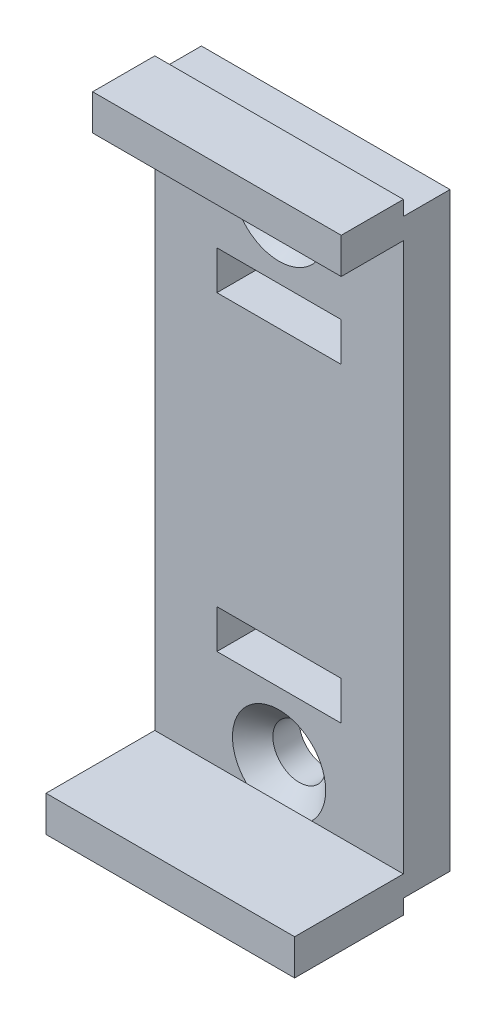
ISO-10303-21;
HEADER;
FILE_DESCRIPTION(('STEP AP214'),'2;1');
FILE_NAME('part.step','',(''),(''),'','','');
FILE_SCHEMA(('AUTOMOTIVE_DESIGN { 1 0 10303 214 1 1 1 1 }'));
ENDSEC;
DATA;
#1=APPLICATION_CONTEXT('core data for automotive mechanical design processes');
#2=APPLICATION_PROTOCOL_DEFINITION('international standard','automotive_design',2000,#1);
#3=PRODUCT_CONTEXT('',#1,'mechanical');
#4=PRODUCT('Part','Part','',(#3));
#5=PRODUCT_RELATED_PRODUCT_CATEGORY('part','',(#4));
#6=PRODUCT_DEFINITION_FORMATION('','',#4);
#7=PRODUCT_DEFINITION_CONTEXT('part definition',#1,'design');
#8=PRODUCT_DEFINITION('design','',#6,#7);
#9=PRODUCT_DEFINITION_SHAPE('','',#8);
#10=(LENGTH_UNIT() NAMED_UNIT(*) SI_UNIT(.MILLI.,.METRE.));
#11=(NAMED_UNIT(*) PLANE_ANGLE_UNIT() SI_UNIT($,.RADIAN.));
#12=(NAMED_UNIT(*) SI_UNIT($,.STERADIAN.) SOLID_ANGLE_UNIT());
#13=UNCERTAINTY_MEASURE_WITH_UNIT(LENGTH_MEASURE(1.E-05),#10,'distance_accuracy_value','');
#14=(GEOMETRIC_REPRESENTATION_CONTEXT(3) GLOBAL_UNCERTAINTY_ASSIGNED_CONTEXT((#13)) GLOBAL_UNIT_ASSIGNED_CONTEXT((#10,
#11,#12)) REPRESENTATION_CONTEXT('',''));
#15=CARTESIAN_POINT('',(0.,0.,0.));
#16=DIRECTION('',(0.,0.,1.));
#17=DIRECTION('',(1.,0.,0.));
#18=AXIS2_PLACEMENT_3D('',#15,#16,#17);
#19=CARTESIAN_POINT('',(0.,15.5,4.));
#20=DIRECTION('',(0.,0.,-1.));
#21=DIRECTION('',(-1.,0.,0.));
#22=AXIS2_PLACEMENT_3D('',#19,#20,#21);
#23=CYLINDRICAL_SURFACE('',#22,1.7);
#24=CARTESIAN_POINT('',(0.,15.5,0.));
#25=DIRECTION('',(0.,0.,1.));
#26=DIRECTION('',(1.,0.,0.));
#27=AXIS2_PLACEMENT_3D('',#24,#25,#26);
#28=CIRCLE('',#27,1.7);
#29=CARTESIAN_POINT('',(1.7,15.5,0.));
#30=VERTEX_POINT('',#29);
#31=EDGE_CURVE('E279',#30,#30,#28,.F.);
#32=ORIENTED_EDGE('',*,*,#31,.T.);
#33=EDGE_LOOP('',(#32));
#34=FACE_BOUND('',#33,.T.);
#35=CARTESIAN_POINT('',(0.,15.5,1.7));
#36=DIRECTION('',(0.,0.,1.));
#37=DIRECTION('',(1.,0.,0.));
#38=AXIS2_PLACEMENT_3D('',#35,#36,#37);
#39=CIRCLE('',#38,1.7);
#40=CARTESIAN_POINT('',(1.7,15.5,1.7));
#41=VERTEX_POINT('',#40);
#42=EDGE_CURVE('E45',#41,#41,#39,.T.);
#43=ORIENTED_EDGE('',*,*,#42,.T.);
#44=EDGE_LOOP('',(#43));
#45=FACE_BOUND('',#44,.T.);
#46=ADVANCED_FACE('F41',(#34,#45),#23,.F.);
#47=CARTESIAN_POINT('',(0.,-15.5,4.));
#48=DIRECTION('',(0.,0.,-1.));
#49=DIRECTION('',(-1.,0.,0.));
#50=AXIS2_PLACEMENT_3D('',#47,#48,#49);
#51=CYLINDRICAL_SURFACE('',#50,1.7);
#52=CARTESIAN_POINT('',(0.,-15.5,0.));
#53=DIRECTION('',(0.,0.,1.));
#54=DIRECTION('',(1.,0.,0.));
#55=AXIS2_PLACEMENT_3D('',#52,#53,#54);
#56=CIRCLE('',#55,1.7);
#57=CARTESIAN_POINT('',(1.7,-15.5,0.));
#58=VERTEX_POINT('',#57);
#59=EDGE_CURVE('E282',#58,#58,#56,.F.);
#60=ORIENTED_EDGE('',*,*,#59,.T.);
#61=EDGE_LOOP('',(#60));
#62=FACE_BOUND('',#61,.T.);
#63=CARTESIAN_POINT('',(0.,-15.5,1.7));
#64=DIRECTION('',(0.,0.,1.));
#65=DIRECTION('',(1.,0.,0.));
#66=AXIS2_PLACEMENT_3D('',#63,#64,#65);
#67=CIRCLE('',#66,1.7);
#68=CARTESIAN_POINT('',(1.7,-15.5,1.7));
#69=VERTEX_POINT('',#68);
#70=EDGE_CURVE('E194',#69,#69,#67,.T.);
#71=ORIENTED_EDGE('',*,*,#70,.T.);
#72=EDGE_LOOP('',(#71));
#73=FACE_BOUND('',#72,.T.);
#74=ADVANCED_FACE('F442',(#62,#73),#51,.F.);
#75=CARTESIAN_POINT('',(0.,0.,3.));
#76=DIRECTION('',(0.,0.,1.));
#77=DIRECTION('',(1.,0.,0.));
#78=AXIS2_PLACEMENT_3D('',#75,#76,#77);
#79=PLANE('',#78);
#80=DIRECTION('',(-1.,0.,0.));
#81=VECTOR('',#80,1.);
#82=CARTESIAN_POINT('',(8.,-17.65,3.));
#83=LINE('',#82,#81);
#84=CARTESIAN_POINT('',(-2.09224759529076,-17.65,3.));
#85=VERTEX_POINT('',#84);
#86=CARTESIAN_POINT('',(-8.,-17.65,3.));
#87=VERTEX_POINT('',#86);
#88=EDGE_CURVE('E209',#85,#87,#83,.T.);
#89=ORIENTED_EDGE('',*,*,#88,.F.);
#90=CARTESIAN_POINT('',(0.,-15.5,3.));
#91=DIRECTION('',(0.,0.,1.));
#92=DIRECTION('',(1.,0.,0.));
#93=AXIS2_PLACEMENT_3D('',#90,#91,#92);
#94=CIRCLE('',#93,3.);
#95=CARTESIAN_POINT('',(2.09224759529076,-17.65,3.));
#96=VERTEX_POINT('',#95);
#97=EDGE_CURVE('E199',#96,#85,#94,.T.);
#98=ORIENTED_EDGE('',*,*,#97,.F.);
#99=CARTESIAN_POINT('',(8.,-17.65,3.));
#100=VERTEX_POINT('',#99);
#101=EDGE_CURVE('E206',#100,#96,#83,.T.);
#102=ORIENTED_EDGE('',*,*,#101,.F.);
#103=DIRECTION('',(0.,1.,0.));
#104=VECTOR('',#103,1.);
#105=CARTESIAN_POINT('',(8.,-19.,3.));
#106=LINE('',#105,#104);
#107=CARTESIAN_POINT('',(8.,17.65,3.));
#108=VERTEX_POINT('',#107);
#109=EDGE_CURVE('E238',#100,#108,#106,.T.);
#110=ORIENTED_EDGE('',*,*,#109,.T.);
#111=DIRECTION('',(1.,0.,0.));
#112=VECTOR('',#111,1.);
#113=CARTESIAN_POINT('',(-8.,17.65,3.));
#114=LINE('',#113,#112);
#115=CARTESIAN_POINT('',(2.09224759529076,17.65,3.));
#116=VERTEX_POINT('',#115);
#117=EDGE_CURVE('E341',#116,#108,#114,.T.);
#118=ORIENTED_EDGE('',*,*,#117,.F.);
#119=CARTESIAN_POINT('',(0.,15.5,3.));
#120=DIRECTION('',(0.,0.,1.));
#121=DIRECTION('',(1.,0.,0.));
#122=AXIS2_PLACEMENT_3D('',#119,#120,#121);
#123=CIRCLE('',#122,3.);
#124=CARTESIAN_POINT('',(-2.09224759529076,17.65,3.));
#125=VERTEX_POINT('',#124);
#126=EDGE_CURVE('E420',#125,#116,#123,.T.);
#127=ORIENTED_EDGE('',*,*,#126,.F.);
#128=CARTESIAN_POINT('',(-8.,17.65,3.));
#129=VERTEX_POINT('',#128);
#130=EDGE_CURVE('E353',#129,#125,#114,.T.);
#131=ORIENTED_EDGE('',*,*,#130,.F.);
#132=DIRECTION('',(0.,-1.,0.));
#133=VECTOR('',#132,1.);
#134=CARTESIAN_POINT('',(-8.,19.,3.));
#135=LINE('',#134,#133);
#136=EDGE_CURVE('E244',#129,#87,#135,.T.);
#137=ORIENTED_EDGE('',*,*,#136,.T.);
#138=EDGE_LOOP('',(#89,#98,#102,#110,#118,#127,#131,#137));
#139=FACE_BOUND('',#138,.T.);
#140=DIRECTION('',(0.,-1.,0.));
#141=VECTOR('',#140,1.);
#142=CARTESIAN_POINT('',(4.,0.,3.));
#143=LINE('',#142,#141);
#144=CARTESIAN_POINT('',(4.,11.25,3.));
#145=VERTEX_POINT('',#144);
#146=CARTESIAN_POINT('',(4.,8.75,3.));
#147=VERTEX_POINT('',#146);
#148=EDGE_CURVE('E323',#145,#147,#143,.T.);
#149=ORIENTED_EDGE('',*,*,#148,.T.);
#150=DIRECTION('',(-1.,0.,0.));
#151=VECTOR('',#150,1.);
#152=CARTESIAN_POINT('',(0.,8.75,3.));
#153=LINE('',#152,#151);
#154=CARTESIAN_POINT('',(-4.,8.75,3.));
#155=VERTEX_POINT('',#154);
#156=EDGE_CURVE('E326',#147,#155,#153,.T.);
#157=ORIENTED_EDGE('',*,*,#156,.T.);
#158=DIRECTION('',(0.,1.,0.));
#159=VECTOR('',#158,1.);
#160=CARTESIAN_POINT('',(-4.,0.,3.));
#161=LINE('',#160,#159);
#162=CARTESIAN_POINT('',(-4.,11.25,3.));
#163=VERTEX_POINT('',#162);
#164=EDGE_CURVE('E308',#155,#163,#161,.T.);
#165=ORIENTED_EDGE('',*,*,#164,.T.);
#166=DIRECTION('',(1.,0.,0.));
#167=VECTOR('',#166,1.);
#168=CARTESIAN_POINT('',(0.,11.25,3.));
#169=LINE('',#168,#167);
#170=EDGE_CURVE('E320',#163,#145,#169,.T.);
#171=ORIENTED_EDGE('',*,*,#170,.T.);
#172=EDGE_LOOP('',(#149,#157,#165,#171));
#173=FACE_BOUND('',#172,.T.);
#174=DIRECTION('',(0.,-1.,0.));
#175=VECTOR('',#174,1.);
#176=CARTESIAN_POINT('',(4.,0.,3.));
#177=LINE('',#176,#175);
#178=CARTESIAN_POINT('',(4.,-8.75,3.));
#179=VERTEX_POINT('',#178);
#180=CARTESIAN_POINT('',(4.,-11.25,3.));
#181=VERTEX_POINT('',#180);
#182=EDGE_CURVE('E335',#179,#181,#177,.T.);
#183=ORIENTED_EDGE('',*,*,#182,.T.);
#184=DIRECTION('',(-1.,0.,0.));
#185=VECTOR('',#184,1.);
#186=CARTESIAN_POINT('',(0.,-11.25,3.));
#187=LINE('',#186,#185);
#188=CARTESIAN_POINT('',(-4.,-11.25,3.));
#189=VERTEX_POINT('',#188);
#190=EDGE_CURVE('E338',#181,#189,#187,.T.);
#191=ORIENTED_EDGE('',*,*,#190,.T.);
#192=DIRECTION('',(0.,1.,0.));
#193=VECTOR('',#192,1.);
#194=CARTESIAN_POINT('',(-4.,0.,3.));
#195=LINE('',#194,#193);
#196=CARTESIAN_POINT('',(-4.,-8.75,3.));
#197=VERTEX_POINT('',#196);
#198=EDGE_CURVE('E329',#189,#197,#195,.T.);
#199=ORIENTED_EDGE('',*,*,#198,.T.);
#200=DIRECTION('',(1.,0.,0.));
#201=VECTOR('',#200,1.);
#202=CARTESIAN_POINT('',(0.,-8.75,3.));
#203=LINE('',#202,#201);
#204=EDGE_CURVE('E332',#197,#179,#203,.T.);
#205=ORIENTED_EDGE('',*,*,#204,.T.);
#206=EDGE_LOOP('',(#183,#191,#199,#205));
#207=FACE_BOUND('',#206,.T.);
#208=ADVANCED_FACE('F203',(#139,#173,#207),#79,.T.);
#209=CARTESIAN_POINT('',(0.,0.,0.));
#210=DIRECTION('',(0.,0.,1.));
#211=DIRECTION('',(1.,0.,0.));
#212=AXIS2_PLACEMENT_3D('',#209,#210,#211);
#213=PLANE('',#212);
#214=ORIENTED_EDGE('',*,*,#59,.F.);
#215=EDGE_LOOP('',(#214));
#216=FACE_BOUND('',#215,.T.);
#217=ORIENTED_EDGE('',*,*,#31,.F.);
#218=EDGE_LOOP('',(#217));
#219=FACE_BOUND('',#218,.T.);
#220=DIRECTION('',(-1.,0.,0.));
#221=VECTOR('',#220,1.);
#222=CARTESIAN_POINT('',(0.,8.75,0.));
#223=LINE('',#222,#221);
#224=CARTESIAN_POINT('',(4.,8.75,0.));
#225=VERTEX_POINT('',#224);
#226=CARTESIAN_POINT('',(-4.,8.75,0.));
#227=VERTEX_POINT('',#226);
#228=EDGE_CURVE('E271',#225,#227,#223,.T.);
#229=ORIENTED_EDGE('',*,*,#228,.F.);
#230=DIRECTION('',(0.,-1.,0.));
#231=VECTOR('',#230,1.);
#232=CARTESIAN_POINT('',(4.,0.,0.));
#233=LINE('',#232,#231);
#234=CARTESIAN_POINT('',(4.,11.25,0.));
#235=VERTEX_POINT('',#234);
#236=EDGE_CURVE('E269',#235,#225,#233,.T.);
#237=ORIENTED_EDGE('',*,*,#236,.F.);
#238=DIRECTION('',(1.,0.,0.));
#239=VECTOR('',#238,1.);
#240=CARTESIAN_POINT('',(0.,11.25,0.));
#241=LINE('',#240,#239);
#242=CARTESIAN_POINT('',(-4.,11.25,0.));
#243=VERTEX_POINT('',#242);
#244=EDGE_CURVE('E267',#243,#235,#241,.T.);
#245=ORIENTED_EDGE('',*,*,#244,.F.);
#246=DIRECTION('',(0.,1.,0.));
#247=VECTOR('',#246,1.);
#248=CARTESIAN_POINT('',(-4.,0.,0.));
#249=LINE('',#248,#247);
#250=EDGE_CURVE('E265',#227,#243,#249,.T.);
#251=ORIENTED_EDGE('',*,*,#250,.F.);
#252=EDGE_LOOP('',(#229,#237,#245,#251));
#253=FACE_BOUND('',#252,.T.);
#254=DIRECTION('',(1.,0.,0.));
#255=VECTOR('',#254,1.);
#256=CARTESIAN_POINT('',(-8.,-19.,0.));
#257=LINE('',#256,#255);
#258=CARTESIAN_POINT('',(-8.,-19.,0.));
#259=VERTEX_POINT('',#258);
#260=CARTESIAN_POINT('',(8.,-19.,0.));
#261=VERTEX_POINT('',#260);
#262=EDGE_CURVE('E234',#259,#261,#257,.T.);
#263=ORIENTED_EDGE('',*,*,#262,.F.);
#264=DIRECTION('',(0.,-1.,0.));
#265=VECTOR('',#264,1.);
#266=CARTESIAN_POINT('',(-8.,19.,0.));
#267=LINE('',#266,#265);
#268=CARTESIAN_POINT('',(-8.,19.,0.));
#269=VERTEX_POINT('',#268);
#270=EDGE_CURVE('E239',#269,#259,#267,.T.);
#271=ORIENTED_EDGE('',*,*,#270,.F.);
#272=DIRECTION('',(-1.,0.,0.));
#273=VECTOR('',#272,1.);
#274=CARTESIAN_POINT('',(8.,19.,0.));
#275=LINE('',#274,#273);
#276=CARTESIAN_POINT('',(8.,19.,0.));
#277=VERTEX_POINT('',#276);
#278=EDGE_CURVE('E251',#277,#269,#275,.T.);
#279=ORIENTED_EDGE('',*,*,#278,.F.);
#280=DIRECTION('',(0.,1.,0.));
#281=VECTOR('',#280,1.);
#282=CARTESIAN_POINT('',(8.,-19.,0.));
#283=LINE('',#282,#281);
#284=EDGE_CURVE('E249',#261,#277,#283,.T.);
#285=ORIENTED_EDGE('',*,*,#284,.F.);
#286=EDGE_LOOP('',(#263,#271,#279,#285));
#287=FACE_BOUND('',#286,.T.);
#288=DIRECTION('',(-1.,0.,0.));
#289=VECTOR('',#288,1.);
#290=CARTESIAN_POINT('',(0.,-11.25,0.));
#291=LINE('',#290,#289);
#292=CARTESIAN_POINT('',(4.,-11.25,0.));
#293=VERTEX_POINT('',#292);
#294=CARTESIAN_POINT('',(-4.,-11.25,0.));
#295=VERTEX_POINT('',#294);
#296=EDGE_CURVE('E11',#293,#295,#291,.T.);
#297=ORIENTED_EDGE('',*,*,#296,.F.);
#298=DIRECTION('',(0.,-1.,0.));
#299=VECTOR('',#298,1.);
#300=CARTESIAN_POINT('',(4.,0.,0.));
#301=LINE('',#300,#299);
#302=CARTESIAN_POINT('',(4.,-8.75,0.));
#303=VERTEX_POINT('',#302);
#304=EDGE_CURVE('E50',#303,#293,#301,.T.);
#305=ORIENTED_EDGE('',*,*,#304,.F.);
#306=DIRECTION('',(1.,0.,0.));
#307=VECTOR('',#306,1.);
#308=CARTESIAN_POINT('',(0.,-8.75,0.));
#309=LINE('',#308,#307);
#310=CARTESIAN_POINT('',(-4.,-8.75,0.));
#311=VERTEX_POINT('',#310);
#312=EDGE_CURVE('E276',#311,#303,#309,.T.);
#313=ORIENTED_EDGE('',*,*,#312,.F.);
#314=DIRECTION('',(0.,1.,0.));
#315=VECTOR('',#314,1.);
#316=CARTESIAN_POINT('',(-4.,0.,0.));
#317=LINE('',#316,#315);
#318=EDGE_CURVE('E274',#295,#311,#317,.T.);
#319=ORIENTED_EDGE('',*,*,#318,.F.);
#320=EDGE_LOOP('',(#297,#305,#313,#319));
#321=FACE_BOUND('',#320,.T.);
#322=ADVANCED_FACE('F394',(#216,#219,#253,#287,#321),#213,.F.);
#323=CARTESIAN_POINT('',(-8.,-19.,3.));
#324=DIRECTION('',(0.,1.,0.));
#325=DIRECTION('',(0.,0.,1.));
#326=AXIS2_PLACEMENT_3D('',#323,#324,#325);
#327=PLANE('',#326);
#328=ORIENTED_EDGE('',*,*,#262,.T.);
#329=DIRECTION('',(0.,0.,-1.));
#330=VECTOR('',#329,1.);
#331=CARTESIAN_POINT('',(8.,-19.,3.));
#332=LINE('',#331,#330);
#333=CARTESIAN_POINT('',(8.,-19.,3.));
#334=VERTEX_POINT('',#333);
#335=EDGE_CURVE('E262',#334,#261,#332,.T.);
#336=ORIENTED_EDGE('',*,*,#335,.F.);
#337=DIRECTION('',(1.,0.,0.));
#338=VECTOR('',#337,1.);
#339=CARTESIAN_POINT('',(-8.,-19.,3.));
#340=LINE('',#339,#338);
#341=CARTESIAN_POINT('',(-8.,-19.,3.));
#342=VERTEX_POINT('',#341);
#343=EDGE_CURVE('E235',#342,#334,#340,.T.);
#344=ORIENTED_EDGE('',*,*,#343,.F.);
#345=DIRECTION('',(0.,0.,-1.));
#346=VECTOR('',#345,1.);
#347=CARTESIAN_POINT('',(-8.,-19.,3.));
#348=LINE('',#347,#346);
#349=EDGE_CURVE('E246',#342,#259,#348,.T.);
#350=ORIENTED_EDGE('',*,*,#349,.T.);
#351=EDGE_LOOP('',(#328,#336,#344,#350));
#352=FACE_BOUND('',#351,.T.);
#353=ADVANCED_FACE('F43',(#352),#327,.F.);
#354=CARTESIAN_POINT('',(8.,-19.,3.));
#355=DIRECTION('',(-1.,0.,0.));
#356=DIRECTION('',(0.,0.,1.));
#357=AXIS2_PLACEMENT_3D('',#354,#355,#356);
#358=PLANE('',#357);
#359=ORIENTED_EDGE('',*,*,#284,.T.);
#360=DIRECTION('',(0.,0.,-1.));
#361=VECTOR('',#360,1.);
#362=CARTESIAN_POINT('',(8.,19.,3.));
#363=LINE('',#362,#361);
#364=CARTESIAN_POINT('',(8.,19.,3.));
#365=VERTEX_POINT('',#364);
#366=EDGE_CURVE('E259',#365,#277,#363,.T.);
#367=ORIENTED_EDGE('',*,*,#366,.F.);
#368=DIRECTION('',(0.,1.,0.));
#369=VECTOR('',#368,1.);
#370=CARTESIAN_POINT('',(8.,17.65,3.));
#371=LINE('',#370,#369);
#372=CARTESIAN_POINT('',(8.,19.95,3.));
#373=VERTEX_POINT('',#372);
#374=EDGE_CURVE('E355',#365,#373,#371,.T.);
#375=ORIENTED_EDGE('',*,*,#374,.T.);
#376=DIRECTION('',(0.,0.,-1.));
#377=VECTOR('',#376,1.);
#378=CARTESIAN_POINT('',(8.,19.95,7.));
#379=LINE('',#378,#377);
#380=CARTESIAN_POINT('',(8.,19.95,7.));
#381=VERTEX_POINT('',#380);
#382=EDGE_CURVE('E366',#381,#373,#379,.T.);
#383=ORIENTED_EDGE('',*,*,#382,.F.);
#384=DIRECTION('',(0.,1.,0.));
#385=VECTOR('',#384,1.);
#386=CARTESIAN_POINT('',(8.,17.65,7.));
#387=LINE('',#386,#385);
#388=CARTESIAN_POINT('',(8.,17.65,7.));
#389=VERTEX_POINT('',#388);
#390=EDGE_CURVE('E345',#389,#381,#387,.T.);
#391=ORIENTED_EDGE('',*,*,#390,.F.);
#392=DIRECTION('',(0.,0.,-1.));
#393=VECTOR('',#392,1.);
#394=CARTESIAN_POINT('',(8.,17.65,7.));
#395=LINE('',#394,#393);
#396=EDGE_CURVE('E369',#389,#108,#395,.T.);
#397=ORIENTED_EDGE('',*,*,#396,.T.);
#398=ORIENTED_EDGE('',*,*,#109,.F.);
#399=DIRECTION('',(0.,0.,-1.));
#400=VECTOR('',#399,1.);
#401=CARTESIAN_POINT('',(8.,-17.65,10.));
#402=LINE('',#401,#400);
#403=CARTESIAN_POINT('',(8.,-17.65,10.));
#404=VERTEX_POINT('',#403);
#405=EDGE_CURVE('E214',#404,#100,#402,.T.);
#406=ORIENTED_EDGE('',*,*,#405,.F.);
#407=DIRECTION('',(0.,1.,0.));
#408=VECTOR('',#407,1.);
#409=CARTESIAN_POINT('',(8.,-19.95,10.));
#410=LINE('',#409,#408);
#411=CARTESIAN_POINT('',(8.,-19.95,10.));
#412=VERTEX_POINT('',#411);
#413=EDGE_CURVE('E375',#412,#404,#410,.T.);
#414=ORIENTED_EDGE('',*,*,#413,.F.);
#415=DIRECTION('',(0.,0.,-1.));
#416=VECTOR('',#415,1.);
#417=CARTESIAN_POINT('',(8.,-19.95,10.));
#418=LINE('',#417,#416);
#419=CARTESIAN_POINT('',(8.,-19.95,3.));
#420=VERTEX_POINT('',#419);
#421=EDGE_CURVE('E231',#412,#420,#418,.T.);
#422=ORIENTED_EDGE('',*,*,#421,.T.);
#423=DIRECTION('',(0.,1.,0.));
#424=VECTOR('',#423,1.);
#425=CARTESIAN_POINT('',(8.,-19.95,3.));
#426=LINE('',#425,#424);
#427=EDGE_CURVE('E219',#420,#334,#426,.T.);
#428=ORIENTED_EDGE('',*,*,#427,.T.);
#429=ORIENTED_EDGE('',*,*,#335,.T.);
#430=EDGE_LOOP('',(#359,#367,#375,#383,#391,#397,#398,#406,#414,#422,#428,#429));
#431=FACE_BOUND('',#430,.T.);
#432=ADVANCED_FACE('F385',(#431),#358,.F.);
#433=CARTESIAN_POINT('',(8.,19.,3.));
#434=DIRECTION('',(0.,-1.,0.));
#435=DIRECTION('',(0.,0.,-1.));
#436=AXIS2_PLACEMENT_3D('',#433,#434,#435);
#437=PLANE('',#436);
#438=ORIENTED_EDGE('',*,*,#278,.T.);
#439=DIRECTION('',(0.,0.,-1.));
#440=VECTOR('',#439,1.);
#441=CARTESIAN_POINT('',(-8.,19.,3.));
#442=LINE('',#441,#440);
#443=CARTESIAN_POINT('',(-8.,19.,3.));
#444=VERTEX_POINT('',#443);
#445=EDGE_CURVE('E256',#444,#269,#442,.T.);
#446=ORIENTED_EDGE('',*,*,#445,.F.);
#447=DIRECTION('',(-1.,0.,0.));
#448=VECTOR('',#447,1.);
#449=CARTESIAN_POINT('',(8.,19.,3.));
#450=LINE('',#449,#448);
#451=EDGE_CURVE('E241',#365,#444,#450,.T.);
#452=ORIENTED_EDGE('',*,*,#451,.F.);
#453=ORIENTED_EDGE('',*,*,#366,.T.);
#454=EDGE_LOOP('',(#438,#446,#452,#453));
#455=FACE_BOUND('',#454,.T.);
#456=ADVANCED_FACE('F399',(#455),#437,.F.);
#457=CARTESIAN_POINT('',(-8.,19.,3.));
#458=DIRECTION('',(1.,0.,0.));
#459=DIRECTION('',(0.,0.,-1.));
#460=AXIS2_PLACEMENT_3D('',#457,#458,#459);
#461=PLANE('',#460);
#462=ORIENTED_EDGE('',*,*,#270,.T.);
#463=ORIENTED_EDGE('',*,*,#349,.F.);
#464=DIRECTION('',(0.,-1.,0.));
#465=VECTOR('',#464,1.);
#466=CARTESIAN_POINT('',(-8.,-17.65,3.));
#467=LINE('',#466,#465);
#468=CARTESIAN_POINT('',(-8.,-19.95,3.));
#469=VERTEX_POINT('',#468);
#470=EDGE_CURVE('E215',#342,#469,#467,.T.);
#471=ORIENTED_EDGE('',*,*,#470,.T.);
#472=DIRECTION('',(0.,0.,-1.));
#473=VECTOR('',#472,1.);
#474=CARTESIAN_POINT('',(-8.,-19.95,10.));
#475=LINE('',#474,#473);
#476=CARTESIAN_POINT('',(-8.,-19.95,10.));
#477=VERTEX_POINT('',#476);
#478=EDGE_CURVE('E223',#477,#469,#475,.T.);
#479=ORIENTED_EDGE('',*,*,#478,.F.);
#480=DIRECTION('',(0.,-1.,0.));
#481=VECTOR('',#480,1.);
#482=CARTESIAN_POINT('',(-8.,-17.65,10.));
#483=LINE('',#482,#481);
#484=CARTESIAN_POINT('',(-8.,-17.65,10.));
#485=VERTEX_POINT('',#484);
#486=EDGE_CURVE('E227',#485,#477,#483,.T.);
#487=ORIENTED_EDGE('',*,*,#486,.F.);
#488=DIRECTION('',(0.,0.,-1.));
#489=VECTOR('',#488,1.);
#490=CARTESIAN_POINT('',(-8.,-17.65,10.));
#491=LINE('',#490,#489);
#492=EDGE_CURVE('E226',#485,#87,#491,.T.);
#493=ORIENTED_EDGE('',*,*,#492,.T.);
#494=ORIENTED_EDGE('',*,*,#136,.F.);
#495=DIRECTION('',(0.,0.,-1.));
#496=VECTOR('',#495,1.);
#497=CARTESIAN_POINT('',(-8.,17.65,7.));
#498=LINE('',#497,#496);
#499=CARTESIAN_POINT('',(-8.,17.65,7.));
#500=VERTEX_POINT('',#499);
#501=EDGE_CURVE('E352',#500,#129,#498,.T.);
#502=ORIENTED_EDGE('',*,*,#501,.F.);
#503=DIRECTION('',(0.,-1.,0.));
#504=VECTOR('',#503,1.);
#505=CARTESIAN_POINT('',(-8.,19.95,7.));
#506=LINE('',#505,#504);
#507=CARTESIAN_POINT('',(-8.,19.95,7.));
#508=VERTEX_POINT('',#507);
#509=EDGE_CURVE('E350',#508,#500,#506,.T.);
#510=ORIENTED_EDGE('',*,*,#509,.F.);
#511=DIRECTION('',(0.,0.,-1.));
#512=VECTOR('',#511,1.);
#513=CARTESIAN_POINT('',(-8.,19.95,7.));
#514=LINE('',#513,#512);
#515=CARTESIAN_POINT('',(-8.,19.95,3.));
#516=VERTEX_POINT('',#515);
#517=EDGE_CURVE('E363',#508,#516,#514,.T.);
#518=ORIENTED_EDGE('',*,*,#517,.T.);
#519=DIRECTION('',(0.,-1.,0.));
#520=VECTOR('',#519,1.);
#521=CARTESIAN_POINT('',(-8.,19.95,3.));
#522=LINE('',#521,#520);
#523=EDGE_CURVE('E346',#516,#444,#522,.T.);
#524=ORIENTED_EDGE('',*,*,#523,.T.);
#525=ORIENTED_EDGE('',*,*,#445,.T.);
#526=EDGE_LOOP('',(#462,#463,#471,#479,#487,#493,#494,#502,#510,#518,#524,#525));
#527=FACE_BOUND('',#526,.T.);
#528=ADVANCED_FACE('F423',(#527),#461,.F.);
#529=CARTESIAN_POINT('',(0.,0.,3.));
#530=DIRECTION('',(0.,0.,1.));
#531=DIRECTION('',(1.,0.,0.));
#532=AXIS2_PLACEMENT_3D('',#529,#530,#531);
#533=PLANE('',#532);
#534=ORIENTED_EDGE('',*,*,#470,.F.);
#535=ORIENTED_EDGE('',*,*,#343,.T.);
#536=ORIENTED_EDGE('',*,*,#427,.F.);
#537=DIRECTION('',(1.,0.,0.));
#538=VECTOR('',#537,1.);
#539=CARTESIAN_POINT('',(-8.,-19.95,3.));
#540=LINE('',#539,#538);
#541=EDGE_CURVE('E372',#469,#420,#540,.T.);
#542=ORIENTED_EDGE('',*,*,#541,.F.);
#543=EDGE_LOOP('',(#534,#535,#536,#542));
#544=FACE_BOUND('',#543,.T.);
#545=ADVANCED_FACE('F388',(#544),#533,.F.);
#546=CARTESIAN_POINT('',(-8.,-19.95,10.));
#547=DIRECTION('',(0.,1.,0.));
#548=DIRECTION('',(0.,0.,1.));
#549=AXIS2_PLACEMENT_3D('',#546,#547,#548);
#550=PLANE('',#549);
#551=ORIENTED_EDGE('',*,*,#541,.T.);
#552=ORIENTED_EDGE('',*,*,#421,.F.);
#553=DIRECTION('',(1.,0.,0.));
#554=VECTOR('',#553,1.);
#555=CARTESIAN_POINT('',(-8.,-19.95,10.));
#556=LINE('',#555,#554);
#557=EDGE_CURVE('E217',#477,#412,#556,.T.);
#558=ORIENTED_EDGE('',*,*,#557,.F.);
#559=ORIENTED_EDGE('',*,*,#478,.T.);
#560=EDGE_LOOP('',(#551,#552,#558,#559));
#561=FACE_BOUND('',#560,.T.);
#562=ADVANCED_FACE('F430',(#561),#550,.F.);
#563=CARTESIAN_POINT('',(8.,-17.65,10.));
#564=DIRECTION('',(0.,-1.,0.));
#565=DIRECTION('',(0.,0.,-1.));
#566=AXIS2_PLACEMENT_3D('',#563,#564,#565);
#567=PLANE('',#566);
#568=ORIENTED_EDGE('',*,*,#101,.T.);
#569=DIRECTION('',(-1.,0.,0.));
#570=VECTOR('',#569,1.);
#571=CARTESIAN_POINT('',(8.,-17.65,3.));
#572=LINE('',#571,#570);
#573=EDGE_CURVE('E190',#96,#85,#572,.T.);
#574=ORIENTED_EDGE('',*,*,#573,.T.);
#575=ORIENTED_EDGE('',*,*,#88,.T.);
#576=ORIENTED_EDGE('',*,*,#492,.F.);
#577=DIRECTION('',(-1.,0.,0.));
#578=VECTOR('',#577,1.);
#579=CARTESIAN_POINT('',(8.,-17.65,10.));
#580=LINE('',#579,#578);
#581=EDGE_CURVE('E377',#404,#485,#580,.T.);
#582=ORIENTED_EDGE('',*,*,#581,.F.);
#583=ORIENTED_EDGE('',*,*,#405,.T.);
#584=EDGE_LOOP('',(#568,#574,#575,#576,#582,#583));
#585=FACE_BOUND('',#584,.T.);
#586=ADVANCED_FACE('F211',(#585),#567,.F.);
#587=CARTESIAN_POINT('',(0.,0.,10.));
#588=DIRECTION('',(0.,0.,1.));
#589=DIRECTION('',(1.,0.,0.));
#590=AXIS2_PLACEMENT_3D('',#587,#588,#589);
#591=PLANE('',#590);
#592=ORIENTED_EDGE('',*,*,#557,.T.);
#593=ORIENTED_EDGE('',*,*,#413,.T.);
#594=ORIENTED_EDGE('',*,*,#581,.T.);
#595=ORIENTED_EDGE('',*,*,#486,.T.);
#596=EDGE_LOOP('',(#592,#593,#594,#595));
#597=FACE_BOUND('',#596,.T.);
#598=ADVANCED_FACE('F428',(#597),#591,.T.);
#599=CARTESIAN_POINT('',(0.,0.,3.));
#600=DIRECTION('',(0.,0.,1.));
#601=DIRECTION('',(1.,0.,0.));
#602=AXIS2_PLACEMENT_3D('',#599,#600,#601);
#603=PLANE('',#602);
#604=ORIENTED_EDGE('',*,*,#374,.F.);
#605=ORIENTED_EDGE('',*,*,#451,.T.);
#606=ORIENTED_EDGE('',*,*,#523,.F.);
#607=DIRECTION('',(-1.,0.,0.));
#608=VECTOR('',#607,1.);
#609=CARTESIAN_POINT('',(8.,19.95,3.));
#610=LINE('',#609,#608);
#611=EDGE_CURVE('E357',#373,#516,#610,.T.);
#612=ORIENTED_EDGE('',*,*,#611,.F.);
#613=EDGE_LOOP('',(#604,#605,#606,#612));
#614=FACE_BOUND('',#613,.T.);
#615=ADVANCED_FACE('F404',(#614),#603,.F.);
#616=CARTESIAN_POINT('',(-8.,17.65,7.));
#617=DIRECTION('',(0.,1.,0.));
#618=DIRECTION('',(0.,0.,1.));
#619=AXIS2_PLACEMENT_3D('',#616,#617,#618);
#620=PLANE('',#619);
#621=ORIENTED_EDGE('',*,*,#130,.T.);
#622=DIRECTION('',(1.,0.,0.));
#623=VECTOR('',#622,1.);
#624=CARTESIAN_POINT('',(-8.,17.65,3.));
#625=LINE('',#624,#623);
#626=EDGE_CURVE('E286',#125,#116,#625,.T.);
#627=ORIENTED_EDGE('',*,*,#626,.T.);
#628=ORIENTED_EDGE('',*,*,#117,.T.);
#629=ORIENTED_EDGE('',*,*,#396,.F.);
#630=DIRECTION('',(1.,0.,0.));
#631=VECTOR('',#630,1.);
#632=CARTESIAN_POINT('',(-8.,17.65,7.));
#633=LINE('',#632,#631);
#634=EDGE_CURVE('E342',#500,#389,#633,.T.);
#635=ORIENTED_EDGE('',*,*,#634,.F.);
#636=ORIENTED_EDGE('',*,*,#501,.T.);
#637=EDGE_LOOP('',(#621,#627,#628,#629,#635,#636));
#638=FACE_BOUND('',#637,.T.);
#639=ADVANCED_FACE('F416',(#638),#620,.F.);
#640=CARTESIAN_POINT('',(8.,19.95,7.));
#641=DIRECTION('',(0.,-1.,0.));
#642=DIRECTION('',(0.,0.,-1.));
#643=AXIS2_PLACEMENT_3D('',#640,#641,#642);
#644=PLANE('',#643);
#645=ORIENTED_EDGE('',*,*,#611,.T.);
#646=ORIENTED_EDGE('',*,*,#517,.F.);
#647=DIRECTION('',(-1.,0.,0.));
#648=VECTOR('',#647,1.);
#649=CARTESIAN_POINT('',(8.,19.95,7.));
#650=LINE('',#649,#648);
#651=EDGE_CURVE('E348',#381,#508,#650,.T.);
#652=ORIENTED_EDGE('',*,*,#651,.F.);
#653=ORIENTED_EDGE('',*,*,#382,.T.);
#654=EDGE_LOOP('',(#645,#646,#652,#653));
#655=FACE_BOUND('',#654,.T.);
#656=ADVANCED_FACE('F408',(#655),#644,.F.);
#657=CARTESIAN_POINT('',(0.,0.,7.));
#658=DIRECTION('',(0.,0.,1.));
#659=DIRECTION('',(1.,0.,0.));
#660=AXIS2_PLACEMENT_3D('',#657,#658,#659);
#661=PLANE('',#660);
#662=ORIENTED_EDGE('',*,*,#634,.T.);
#663=ORIENTED_EDGE('',*,*,#390,.T.);
#664=ORIENTED_EDGE('',*,*,#651,.T.);
#665=ORIENTED_EDGE('',*,*,#509,.T.);
#666=EDGE_LOOP('',(#662,#663,#664,#665));
#667=FACE_BOUND('',#666,.T.);
#668=ADVANCED_FACE('F412',(#667),#661,.T.);
#669=CARTESIAN_POINT('',(4.,8.75,4.));
#670=DIRECTION('',(0.,1.,0.));
#671=DIRECTION('',(0.,0.,1.));
#672=AXIS2_PLACEMENT_3D('',#669,#670,#671);
#673=PLANE('',#672);
#674=DIRECTION('',(0.,0.,-1.));
#675=VECTOR('',#674,1.);
#676=CARTESIAN_POINT('',(4.,8.75,4.));
#677=LINE('',#676,#675);
#678=EDGE_CURVE('E284',#147,#225,#677,.T.);
#679=ORIENTED_EDGE('',*,*,#678,.T.);
#680=ORIENTED_EDGE('',*,*,#228,.T.);
#681=DIRECTION('',(0.,0.,-1.));
#682=VECTOR('',#681,1.);
#683=CARTESIAN_POINT('',(-4.,8.75,4.));
#684=LINE('',#683,#682);
#685=EDGE_CURVE('E299',#155,#227,#684,.T.);
#686=ORIENTED_EDGE('',*,*,#685,.F.);
#687=ORIENTED_EDGE('',*,*,#156,.F.);
#688=EDGE_LOOP('',(#679,#680,#686,#687));
#689=FACE_BOUND('',#688,.T.);
#690=ADVANCED_FACE('F471',(#689),#673,.T.);
#691=CARTESIAN_POINT('',(4.,11.25,4.));
#692=DIRECTION('',(-1.,0.,0.));
#693=DIRECTION('',(0.,0.,1.));
#694=AXIS2_PLACEMENT_3D('',#691,#692,#693);
#695=PLANE('',#694);
#696=DIRECTION('',(0.,0.,-1.));
#697=VECTOR('',#696,1.);
#698=CARTESIAN_POINT('',(4.,11.25,4.));
#699=LINE('',#698,#697);
#700=EDGE_CURVE('E311',#145,#235,#699,.T.);
#701=ORIENTED_EDGE('',*,*,#700,.T.);
#702=ORIENTED_EDGE('',*,*,#236,.T.);
#703=ORIENTED_EDGE('',*,*,#678,.F.);
#704=ORIENTED_EDGE('',*,*,#148,.F.);
#705=EDGE_LOOP('',(#701,#702,#703,#704));
#706=FACE_BOUND('',#705,.T.);
#707=ADVANCED_FACE('F474',(#706),#695,.T.);
#708=CARTESIAN_POINT('',(-4.,11.25,4.));
#709=DIRECTION('',(0.,-1.,0.));
#710=DIRECTION('',(0.,0.,-1.));
#711=AXIS2_PLACEMENT_3D('',#708,#709,#710);
#712=PLANE('',#711);
#713=DIRECTION('',(0.,0.,-1.));
#714=VECTOR('',#713,1.);
#715=CARTESIAN_POINT('',(-4.,11.25,4.));
#716=LINE('',#715,#714);
#717=EDGE_CURVE('E314',#163,#243,#716,.T.);
#718=ORIENTED_EDGE('',*,*,#717,.T.);
#719=ORIENTED_EDGE('',*,*,#244,.T.);
#720=ORIENTED_EDGE('',*,*,#700,.F.);
#721=ORIENTED_EDGE('',*,*,#170,.F.);
#722=EDGE_LOOP('',(#718,#719,#720,#721));
#723=FACE_BOUND('',#722,.T.);
#724=ADVANCED_FACE('F478',(#723),#712,.T.);
#725=CARTESIAN_POINT('',(-4.,8.75,4.));
#726=DIRECTION('',(1.,0.,0.));
#727=DIRECTION('',(0.,0.,-1.));
#728=AXIS2_PLACEMENT_3D('',#725,#726,#727);
#729=PLANE('',#728);
#730=ORIENTED_EDGE('',*,*,#685,.T.);
#731=ORIENTED_EDGE('',*,*,#250,.T.);
#732=ORIENTED_EDGE('',*,*,#717,.F.);
#733=ORIENTED_EDGE('',*,*,#164,.F.);
#734=EDGE_LOOP('',(#730,#731,#732,#733));
#735=FACE_BOUND('',#734,.T.);
#736=ADVANCED_FACE('F469',(#735),#729,.T.);
#737=CARTESIAN_POINT('',(4.,-11.25,4.));
#738=DIRECTION('',(0.,1.,0.));
#739=DIRECTION('',(0.,0.,1.));
#740=AXIS2_PLACEMENT_3D('',#737,#738,#739);
#741=PLANE('',#740);
#742=DIRECTION('',(0.,0.,-1.));
#743=VECTOR('',#742,1.);
#744=CARTESIAN_POINT('',(4.,-11.25,4.));
#745=LINE('',#744,#743);
#746=EDGE_CURVE('E305',#181,#293,#745,.T.);
#747=ORIENTED_EDGE('',*,*,#746,.T.);
#748=ORIENTED_EDGE('',*,*,#296,.T.);
#749=DIRECTION('',(0.,0.,-1.));
#750=VECTOR('',#749,1.);
#751=CARTESIAN_POINT('',(-4.,-11.25,4.));
#752=LINE('',#751,#750);
#753=EDGE_CURVE('E296',#189,#295,#752,.T.);
#754=ORIENTED_EDGE('',*,*,#753,.F.);
#755=ORIENTED_EDGE('',*,*,#190,.F.);
#756=EDGE_LOOP('',(#747,#748,#754,#755));
#757=FACE_BOUND('',#756,.T.);
#758=ADVANCED_FACE('F465',(#757),#741,.T.);
#759=CARTESIAN_POINT('',(4.,-8.75,4.));
#760=DIRECTION('',(-1.,0.,0.));
#761=DIRECTION('',(0.,0.,1.));
#762=AXIS2_PLACEMENT_3D('',#759,#760,#761);
#763=PLANE('',#762);
#764=DIRECTION('',(0.,0.,-1.));
#765=VECTOR('',#764,1.);
#766=CARTESIAN_POINT('',(4.,-8.75,4.));
#767=LINE('',#766,#765);
#768=EDGE_CURVE('E302',#179,#303,#767,.T.);
#769=ORIENTED_EDGE('',*,*,#768,.T.);
#770=ORIENTED_EDGE('',*,*,#304,.T.);
#771=ORIENTED_EDGE('',*,*,#746,.F.);
#772=ORIENTED_EDGE('',*,*,#182,.F.);
#773=EDGE_LOOP('',(#769,#770,#771,#772));
#774=FACE_BOUND('',#773,.T.);
#775=ADVANCED_FACE('F461',(#774),#763,.T.);
#776=CARTESIAN_POINT('',(-4.,-8.75,4.));
#777=DIRECTION('',(0.,-1.,0.));
#778=DIRECTION('',(0.,0.,-1.));
#779=AXIS2_PLACEMENT_3D('',#776,#777,#778);
#780=PLANE('',#779);
#781=DIRECTION('',(0.,0.,-1.));
#782=VECTOR('',#781,1.);
#783=CARTESIAN_POINT('',(-4.,-8.75,4.));
#784=LINE('',#783,#782);
#785=EDGE_CURVE('E298',#197,#311,#784,.T.);
#786=ORIENTED_EDGE('',*,*,#785,.T.);
#787=ORIENTED_EDGE('',*,*,#312,.T.);
#788=ORIENTED_EDGE('',*,*,#768,.F.);
#789=ORIENTED_EDGE('',*,*,#204,.F.);
#790=EDGE_LOOP('',(#786,#787,#788,#789));
#791=FACE_BOUND('',#790,.T.);
#792=ADVANCED_FACE('F457',(#791),#780,.T.);
#793=CARTESIAN_POINT('',(-4.,-11.25,4.));
#794=DIRECTION('',(1.,0.,0.));
#795=DIRECTION('',(0.,0.,-1.));
#796=AXIS2_PLACEMENT_3D('',#793,#794,#795);
#797=PLANE('',#796);
#798=ORIENTED_EDGE('',*,*,#753,.T.);
#799=ORIENTED_EDGE('',*,*,#318,.T.);
#800=ORIENTED_EDGE('',*,*,#785,.F.);
#801=ORIENTED_EDGE('',*,*,#198,.F.);
#802=EDGE_LOOP('',(#798,#799,#800,#801));
#803=FACE_BOUND('',#802,.T.);
#804=ADVANCED_FACE('F454',(#803),#797,.T.);
#805=CARTESIAN_POINT('',(0.,-15.5,3.));
#806=DIRECTION('',(0.,0.,1.));
#807=DIRECTION('',(1.,0.,0.));
#808=AXIS2_PLACEMENT_3D('',#805,#806,#807);
#809=PLANE('',#808);
#810=EDGE_CURVE('E57',#85,#96,#94,.T.);
#811=ORIENTED_EDGE('',*,*,#810,.F.);
#812=ORIENTED_EDGE('',*,*,#573,.F.);
#813=EDGE_LOOP('',(#811,#812));
#814=FACE_BOUND('',#813,.T.);
#815=ADVANCED_FACE('F191',(#814),#809,.F.);
#816=CARTESIAN_POINT('',(0.,-15.5,1.5));
#817=DIRECTION('',(0.,0.,1.));
#818=DIRECTION('',(1.,0.,0.));
#819=AXIS2_PLACEMENT_3D('',#816,#817,#818);
#820=CONICAL_SURFACE('',#819,1.5,0.785398163397448);
#821=ORIENTED_EDGE('',*,*,#70,.F.);
#822=EDGE_LOOP('',(#821));
#823=FACE_BOUND('',#822,.T.);
#824=ORIENTED_EDGE('',*,*,#810,.T.);
#825=ORIENTED_EDGE('',*,*,#97,.T.);
#826=EDGE_LOOP('',(#824,#825));
#827=FACE_BOUND('',#826,.T.);
#828=ADVANCED_FACE('F198',(#823,#827),#820,.F.);
#829=CARTESIAN_POINT('',(0.,15.5,3.));
#830=DIRECTION('',(0.,0.,1.));
#831=DIRECTION('',(1.,0.,0.));
#832=AXIS2_PLACEMENT_3D('',#829,#830,#831);
#833=PLANE('',#832);
#834=EDGE_CURVE('E64',#116,#125,#123,.T.);
#835=ORIENTED_EDGE('',*,*,#834,.F.);
#836=ORIENTED_EDGE('',*,*,#626,.F.);
#837=EDGE_LOOP('',(#835,#836));
#838=FACE_BOUND('',#837,.T.);
#839=ADVANCED_FACE('F623',(#838),#833,.F.);
#840=CARTESIAN_POINT('',(0.,15.5,1.5));
#841=DIRECTION('',(0.,0.,1.));
#842=DIRECTION('',(1.,0.,0.));
#843=AXIS2_PLACEMENT_3D('',#840,#841,#842);
#844=CONICAL_SURFACE('',#843,1.5,0.785398163397448);
#845=ORIENTED_EDGE('',*,*,#42,.F.);
#846=EDGE_LOOP('',(#845));
#847=FACE_BOUND('',#846,.T.);
#848=ORIENTED_EDGE('',*,*,#834,.T.);
#849=ORIENTED_EDGE('',*,*,#126,.T.);
#850=EDGE_LOOP('',(#848,#849));
#851=FACE_BOUND('',#850,.T.);
#852=ADVANCED_FACE('F632',(#847,#851),#844,.F.);
#853=CLOSED_SHELL('',(#46,#74,#208,#322,#353,#432,#456,#528,#545,#562,#586,#598,#615,#639,#656,
#668,#690,#707,#724,#736,#758,#775,#792,#804,#815,#828,#839,#852));
#854=MANIFOLD_SOLID_BREP('B2',#853);
#855=ADVANCED_BREP_SHAPE_REPRESENTATION('',(#18,#854),#14);
#856=SHAPE_DEFINITION_REPRESENTATION(#9,#855);
ENDSEC;
END-ISO-10303-21;
